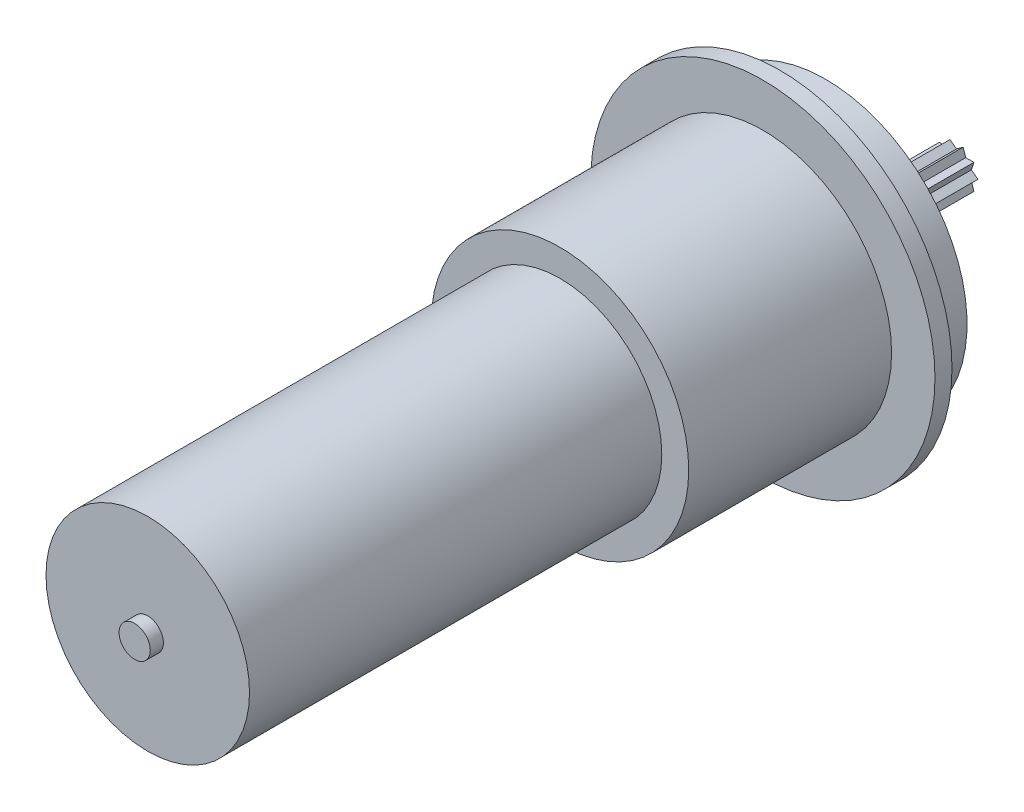
ISO-10303-21;
HEADER;
FILE_DESCRIPTION(('STEP AP214'),'2;1');
FILE_NAME('part.step','',(''),(''),'','','');
FILE_SCHEMA(('AUTOMOTIVE_DESIGN { 1 0 10303 214 1 1 1 1 }'));
ENDSEC;
DATA;
#1=APPLICATION_CONTEXT('core data for automotive mechanical design processes');
#2=APPLICATION_PROTOCOL_DEFINITION('international standard','automotive_design',2000,#1);
#3=PRODUCT_CONTEXT('',#1,'mechanical');
#4=PRODUCT('Part','Part','',(#3));
#5=PRODUCT_RELATED_PRODUCT_CATEGORY('part','',(#4));
#6=PRODUCT_DEFINITION_FORMATION('','',#4);
#7=PRODUCT_DEFINITION_CONTEXT('part definition',#1,'design');
#8=PRODUCT_DEFINITION('design','',#6,#7);
#9=PRODUCT_DEFINITION_SHAPE('','',#8);
#10=(LENGTH_UNIT() NAMED_UNIT(*) SI_UNIT(.MILLI.,.METRE.));
#11=(NAMED_UNIT(*) PLANE_ANGLE_UNIT() SI_UNIT($,.RADIAN.));
#12=(NAMED_UNIT(*) SI_UNIT($,.STERADIAN.) SOLID_ANGLE_UNIT());
#13=UNCERTAINTY_MEASURE_WITH_UNIT(LENGTH_MEASURE(1.E-05),#10,'distance_accuracy_value','');
#14=(GEOMETRIC_REPRESENTATION_CONTEXT(3) GLOBAL_UNCERTAINTY_ASSIGNED_CONTEXT((#13)) GLOBAL_UNIT_ASSIGNED_CONTEXT((#10,
#11,#12)) REPRESENTATION_CONTEXT('',''));
#15=CARTESIAN_POINT('',(0.,0.,0.));
#16=DIRECTION('',(0.,0.,1.));
#17=DIRECTION('',(1.,0.,0.));
#18=AXIS2_PLACEMENT_3D('',#15,#16,#17);
#19=CARTESIAN_POINT('',(0.,0.,78.74));
#20=DIRECTION('',(0.,0.,-1.));
#21=DIRECTION('',(-1.,0.,0.));
#22=AXIS2_PLACEMENT_3D('',#19,#20,#21);
#23=CYLINDRICAL_SURFACE('',#22,49.9618);
#24=CARTESIAN_POINT('',(0.,0.,78.74));
#25=DIRECTION('',(0.,0.,1.));
#26=DIRECTION('',(1.,0.,0.));
#27=AXIS2_PLACEMENT_3D('',#24,#25,#26);
#28=CIRCLE('',#27,49.9618);
#29=CARTESIAN_POINT('',(49.9618,0.,78.74));
#30=VERTEX_POINT('',#29);
#31=EDGE_CURVE('E212',#30,#30,#28,.T.);
#32=ORIENTED_EDGE('',*,*,#31,.F.);
#33=EDGE_LOOP('',(#32));
#34=FACE_BOUND('',#33,.T.);
#35=CARTESIAN_POINT('',(0.,0.,0.));
#36=DIRECTION('',(0.,0.,1.));
#37=DIRECTION('',(1.,0.,0.));
#38=AXIS2_PLACEMENT_3D('',#35,#36,#37);
#39=CIRCLE('',#38,49.9618);
#40=CARTESIAN_POINT('',(49.9618,0.,0.));
#41=VERTEX_POINT('',#40);
#42=EDGE_CURVE('E39',#41,#41,#39,.T.);
#43=ORIENTED_EDGE('',*,*,#42,.T.);
#44=EDGE_LOOP('',(#43));
#45=FACE_BOUND('',#44,.T.);
#46=ADVANCED_FACE('F36',(#34,#45),#23,.T.);
#47=CARTESIAN_POINT('',(0.,0.,78.74));
#48=DIRECTION('',(0.,0.,1.));
#49=DIRECTION('',(1.,0.,0.));
#50=AXIS2_PLACEMENT_3D('',#47,#48,#49);
#51=PLANE('',#50);
#52=CARTESIAN_POINT('',(0.,0.,78.74));
#53=DIRECTION('',(0.,0.,1.));
#54=DIRECTION('',(1.,0.,0.));
#55=AXIS2_PLACEMENT_3D('',#52,#53,#54);
#56=CIRCLE('',#55,39.4969999999999);
#57=CARTESIAN_POINT('',(39.4969999999999,0.,78.74));
#58=VERTEX_POINT('',#57);
#59=EDGE_CURVE('E44',#58,#58,#56,.T.);
#60=ORIENTED_EDGE('',*,*,#59,.F.);
#61=EDGE_LOOP('',(#60));
#62=FACE_BOUND('',#61,.T.);
#63=ORIENTED_EDGE('',*,*,#31,.T.);
#64=EDGE_LOOP('',(#63));
#65=FACE_BOUND('',#64,.T.);
#66=ADVANCED_FACE('F234',(#62,#65),#51,.T.);
#67=CARTESIAN_POINT('',(0.,0.,-6.604));
#68=DIRECTION('',(0.,0.,1.));
#69=DIRECTION('',(1.,0.,0.));
#70=AXIS2_PLACEMENT_3D('',#67,#68,#69);
#71=CYLINDRICAL_SURFACE('',#70,66.802);
#72=CARTESIAN_POINT('',(0.,0.,-6.604));
#73=DIRECTION('',(0.,0.,-1.));
#74=DIRECTION('',(-1.,0.,0.));
#75=AXIS2_PLACEMENT_3D('',#72,#73,#74);
#76=CIRCLE('',#75,66.802);
#77=CARTESIAN_POINT('',(66.802,0.,-6.604));
#78=VERTEX_POINT('',#77);
#79=EDGE_CURVE('E213',#78,#78,#76,.T.);
#80=CARTESIAN_POINT('',(0.,0.,0.));
#81=DIRECTION('',(0.,0.,-1.));
#82=DIRECTION('',(-1.,0.,0.));
#83=AXIS2_PLACEMENT_3D('',#80,#81,#82);
#84=CIRCLE('',#83,66.802);
#85=CARTESIAN_POINT('',(66.802,0.,0.));
#86=VERTEX_POINT('',#85);
#87=EDGE_CURVE('E209',#86,#86,#84,.T.);
#88=CARTESIAN_POINT('',(66.802,0.,-6.604));
#89=CARTESIAN_POINT('',(66.802,0.,-6.53520833333333));
#90=CARTESIAN_POINT('',(66.802,0.,-6.46641666666667));
#91=CARTESIAN_POINT('',(66.802,0.,-6.32883333333333));
#92=CARTESIAN_POINT('',(66.802,0.,-6.26004166666667));
#93=CARTESIAN_POINT('',(66.802,0.,-6.12245833333333));
#94=CARTESIAN_POINT('',(66.802,0.,-6.05366666666667));
#95=CARTESIAN_POINT('',(66.802,0.,-5.91608333333333));
#96=CARTESIAN_POINT('',(66.802,0.,-5.84729166666667));
#97=CARTESIAN_POINT('',(66.802,0.,-5.70970833333333));
#98=CARTESIAN_POINT('',(66.802,0.,-5.64091666666667));
#99=CARTESIAN_POINT('',(66.802,0.,-5.50333333333333));
#100=CARTESIAN_POINT('',(66.802,0.,-5.43454166666667));
#101=CARTESIAN_POINT('',(66.802,0.,-5.29695833333333));
#102=CARTESIAN_POINT('',(66.802,0.,-5.22816666666667));
#103=CARTESIAN_POINT('',(66.802,0.,-5.09058333333333));
#104=CARTESIAN_POINT('',(66.802,0.,-5.02179166666667));
#105=CARTESIAN_POINT('',(66.802,0.,-4.88420833333333));
#106=CARTESIAN_POINT('',(66.802,0.,-4.81541666666667));
#107=CARTESIAN_POINT('',(66.802,0.,-4.67783333333333));
#108=CARTESIAN_POINT('',(66.802,0.,-4.60904166666667));
#109=CARTESIAN_POINT('',(66.802,0.,-4.47145833333333));
#110=CARTESIAN_POINT('',(66.802,0.,-4.40266666666667));
#111=CARTESIAN_POINT('',(66.802,0.,-4.26508333333333));
#112=CARTESIAN_POINT('',(66.802,0.,-4.19629166666667));
#113=CARTESIAN_POINT('',(66.802,0.,-4.05870833333333));
#114=CARTESIAN_POINT('',(66.802,0.,-3.98991666666667));
#115=CARTESIAN_POINT('',(66.802,0.,-3.85233333333333));
#116=CARTESIAN_POINT('',(66.802,0.,-3.78354166666667));
#117=CARTESIAN_POINT('',(66.802,0.,-3.64595833333333));
#118=CARTESIAN_POINT('',(66.802,0.,-3.57716666666667));
#119=CARTESIAN_POINT('',(66.802,0.,-3.43958333333333));
#120=CARTESIAN_POINT('',(66.802,0.,-3.37079166666667));
#121=CARTESIAN_POINT('',(66.802,0.,-3.23320833333333));
#122=CARTESIAN_POINT('',(66.802,0.,-3.16441666666667));
#123=CARTESIAN_POINT('',(66.802,0.,-3.02683333333333));
#124=CARTESIAN_POINT('',(66.802,0.,-2.95804166666667));
#125=CARTESIAN_POINT('',(66.802,0.,-2.82045833333333));
#126=CARTESIAN_POINT('',(66.802,0.,-2.75166666666667));
#127=CARTESIAN_POINT('',(66.802,0.,-2.61408333333333));
#128=CARTESIAN_POINT('',(66.802,0.,-2.54529166666667));
#129=CARTESIAN_POINT('',(66.802,0.,-2.40770833333333));
#130=CARTESIAN_POINT('',(66.802,0.,-2.33891666666667));
#131=CARTESIAN_POINT('',(66.802,0.,-2.20133333333333));
#132=CARTESIAN_POINT('',(66.802,0.,-2.13254166666667));
#133=CARTESIAN_POINT('',(66.802,0.,-1.99495833333333));
#134=CARTESIAN_POINT('',(66.802,0.,-1.92616666666667));
#135=CARTESIAN_POINT('',(66.802,0.,-1.78858333333333));
#136=CARTESIAN_POINT('',(66.802,0.,-1.71979166666667));
#137=CARTESIAN_POINT('',(66.802,0.,-1.58220833333333));
#138=CARTESIAN_POINT('',(66.802,0.,-1.51341666666667));
#139=CARTESIAN_POINT('',(66.802,0.,-1.37583333333333));
#140=CARTESIAN_POINT('',(66.802,0.,-1.30704166666667));
#141=CARTESIAN_POINT('',(66.802,0.,-1.16945833333333));
#142=CARTESIAN_POINT('',(66.802,0.,-1.10066666666667));
#143=CARTESIAN_POINT('',(66.802,0.,-0.963083333333333));
#144=CARTESIAN_POINT('',(66.802,0.,-0.894291666666666));
#145=CARTESIAN_POINT('',(66.802,0.,-0.756708333333333));
#146=CARTESIAN_POINT('',(66.802,0.,-0.687916666666667));
#147=CARTESIAN_POINT('',(66.802,0.,-0.550333333333333));
#148=CARTESIAN_POINT('',(66.802,0.,-0.481541666666667));
#149=CARTESIAN_POINT('',(66.802,0.,-0.343958333333333));
#150=CARTESIAN_POINT('',(66.802,0.,-0.275166666666667));
#151=CARTESIAN_POINT('',(66.802,0.,-0.137583333333333));
#152=CARTESIAN_POINT('',(66.802,0.,-0.0687916666666666));
#153=CARTESIAN_POINT('',(66.802,0.,0.));
#154=B_SPLINE_CURVE_WITH_KNOTS('',3,(#88,#89,#90,#91,#92,#93,#94,#95,#96,#97,#98,#99,#100,#101,
#102,#103,#104,#105,#106,#107,#108,#109,#110,#111,#112,#113,#114,#115,#116,#117,#118,#119,#120,
#121,#122,#123,#124,#125,#126,#127,#128,#129,#130,#131,#132,#133,#134,#135,#136,#137,#138,#139,
#140,#141,#142,#143,#144,#145,#146,#147,#148,#149,#150,#151,#152,#153),.UNSPECIFIED.,.F.,.F.,(4,
2,2,2,2,2,2,2,2,2,2,2,2,2,2,2,2,2,2,2,2,2,2,2,2,2,2,2,2,2,2,2,4),(0.,0.206375,0.41275,0.619125,
0.8255,1.031875,1.23825,1.444625,1.651,1.857375,2.06375,2.270125,2.4765,2.682875,2.88925,
3.095625,3.302,3.508375,3.71475,3.921125,4.1275,4.333875,4.54025,4.746625,4.953,5.159375,
5.36575,5.572125,5.7785,5.984875,6.19125,6.397625,6.604),.UNSPECIFIED.);
#155=EDGE_CURVE('BSEAM232',#78,#86,#154,.T.);
#156=ORIENTED_EDGE('',*,*,#79,.F.);
#157=ORIENTED_EDGE('',*,*,#87,.T.);
#158=ORIENTED_EDGE('',*,*,#155,.T.);
#159=ORIENTED_EDGE('',*,*,#155,.F.);
#160=EDGE_LOOP('',(#156,#158,#157,#159));
#161=FACE_BOUND('',#160,.T.);
#162=ADVANCED_FACE('F232',(#161),#71,.T.);
#163=CARTESIAN_POINT('',(0.,0.,-6.604));
#164=DIRECTION('',(0.,0.,-1.));
#165=DIRECTION('',(-1.,0.,0.));
#166=AXIS2_PLACEMENT_3D('',#163,#164,#165);
#167=PLANE('',#166);
#168=CARTESIAN_POINT('',(0.,0.,-6.604));
#169=DIRECTION('',(0.,0.,-1.));
#170=DIRECTION('',(-1.,0.,0.));
#171=AXIS2_PLACEMENT_3D('',#168,#169,#170);
#172=CIRCLE('',#171,54.864);
#173=CARTESIAN_POINT('',(-54.864,0.,-6.604));
#174=VERTEX_POINT('',#173);
#175=EDGE_CURVE('E206',#174,#174,#172,.T.);
#176=ORIENTED_EDGE('',*,*,#175,.F.);
#177=EDGE_LOOP('',(#176));
#178=FACE_BOUND('',#177,.T.);
#179=ORIENTED_EDGE('',*,*,#79,.T.);
#180=EDGE_LOOP('',(#179));
#181=FACE_BOUND('',#180,.T.);
#182=ADVANCED_FACE('F228',(#178,#181),#167,.T.);
#183=CARTESIAN_POINT('',(0.,0.,0.));
#184=DIRECTION('',(0.,0.,-1.));
#185=DIRECTION('',(-1.,0.,0.));
#186=AXIS2_PLACEMENT_3D('',#183,#184,#185);
#187=PLANE('',#186);
#188=ORIENTED_EDGE('',*,*,#42,.F.);
#189=EDGE_LOOP('',(#188));
#190=FACE_BOUND('',#189,.T.);
#191=ORIENTED_EDGE('',*,*,#87,.F.);
#192=EDGE_LOOP('',(#191));
#193=FACE_BOUND('',#192,.T.);
#194=ADVANCED_FACE('F224',(#190,#193),#187,.F.);
#195=CARTESIAN_POINT('',(0.,0.,-24.384));
#196=DIRECTION('',(0.,0.,1.));
#197=DIRECTION('',(1.,0.,0.));
#198=AXIS2_PLACEMENT_3D('',#195,#196,#197);
#199=CYLINDRICAL_SURFACE('',#198,54.864);
#200=CARTESIAN_POINT('',(0.,0.,-24.384));
#201=DIRECTION('',(0.,0.,-1.));
#202=DIRECTION('',(-1.,0.,0.));
#203=AXIS2_PLACEMENT_3D('',#200,#201,#202);
#204=CIRCLE('',#203,54.864);
#205=CARTESIAN_POINT('',(-54.864,0.,-24.384));
#206=VERTEX_POINT('',#205);
#207=EDGE_CURVE('E197',#206,#206,#204,.T.);
#208=ORIENTED_EDGE('',*,*,#207,.F.);
#209=EDGE_LOOP('',(#208));
#210=FACE_BOUND('',#209,.T.);
#211=ORIENTED_EDGE('',*,*,#175,.T.);
#212=EDGE_LOOP('',(#211));
#213=FACE_BOUND('',#212,.T.);
#214=ADVANCED_FACE('F227',(#210,#213),#199,.T.);
#215=CARTESIAN_POINT('',(0.,0.,-24.384));
#216=DIRECTION('',(0.,0.,-1.));
#217=DIRECTION('',(-1.,0.,0.));
#218=AXIS2_PLACEMENT_3D('',#215,#216,#217);
#219=PLANE('',#218);
#220=CARTESIAN_POINT('',(0.,0.,-24.384));
#221=DIRECTION('',(0.,0.,-1.));
#222=DIRECTION('',(-1.,0.,0.));
#223=AXIS2_PLACEMENT_3D('',#220,#221,#222);
#224=CIRCLE('',#223,11.8780065255691);
#225=CARTESIAN_POINT('',(-11.8780065255691,0.,-24.384));
#226=VERTEX_POINT('',#225);
#227=EDGE_CURVE('E203',#226,#226,#224,.T.);
#228=ORIENTED_EDGE('',*,*,#227,.F.);
#229=EDGE_LOOP('',(#228));
#230=FACE_BOUND('',#229,.T.);
#231=ORIENTED_EDGE('',*,*,#207,.T.);
#232=EDGE_LOOP('',(#231));
#233=FACE_BOUND('',#232,.T.);
#234=ADVANCED_FACE('F278',(#230,#233),#219,.T.);
#235=CARTESIAN_POINT('',(0.,0.,-37.084));
#236=DIRECTION('',(0.,0.,1.));
#237=DIRECTION('',(1.,0.,0.));
#238=AXIS2_PLACEMENT_3D('',#235,#236,#237);
#239=CYLINDRICAL_SURFACE('',#238,11.8780065255691);
#240=CARTESIAN_POINT('',(0.,0.,-37.084));
#241=DIRECTION('',(0.,0.,-1.));
#242=DIRECTION('',(-1.,0.,0.));
#243=AXIS2_PLACEMENT_3D('',#240,#241,#242);
#244=CIRCLE('',#243,11.8780065255691);
#245=CARTESIAN_POINT('',(-11.8780065255691,0.,-37.084));
#246=VERTEX_POINT('',#245);
#247=EDGE_CURVE('E194',#246,#246,#244,.T.);
#248=ORIENTED_EDGE('',*,*,#247,.F.);
#249=EDGE_LOOP('',(#248));
#250=FACE_BOUND('',#249,.T.);
#251=ORIENTED_EDGE('',*,*,#227,.T.);
#252=EDGE_LOOP('',(#251));
#253=FACE_BOUND('',#252,.T.);
#254=ADVANCED_FACE('F283',(#250,#253),#239,.T.);
#255=CARTESIAN_POINT('',(0.,0.,-37.084));
#256=DIRECTION('',(0.,0.,-1.));
#257=DIRECTION('',(-1.,0.,0.));
#258=AXIS2_PLACEMENT_3D('',#255,#256,#257);
#259=PLANE('',#258);
#260=DIRECTION('',(-0.809016994374932,0.587785252292494,0.));
#261=VECTOR('',#260,1.);
#262=CARTESIAN_POINT('',(-5.74575498030823,-1.86690896283038,-37.084));
#263=LINE('',#262,#261);
#264=CARTESIAN_POINT('',(-5.74575498030823,-1.86690896283038,-37.084));
#265=VERTEX_POINT('',#264);
#266=CARTESIAN_POINT('',(-8.3153347239136,1.29533520327135E-13,-37.084));
#267=VERTEX_POINT('',#266);
#268=EDGE_CURVE('E52',#265,#267,#263,.T.);
#269=ORIENTED_EDGE('',*,*,#268,.F.);
#270=DIRECTION('',(0.309016994375006,0.951056516295135,0.));
#271=VECTOR('',#270,1.);
#272=CARTESIAN_POINT('',(-6.72724710556244,-4.88763111859181,-37.084));
#273=LINE('',#272,#271);
#274=CARTESIAN_POINT('',(-6.72724710556244,-4.88763111859181,-37.084));
#275=VERTEX_POINT('',#274);
#276=EDGE_CURVE('E56',#275,#265,#273,.T.);
#277=ORIENTED_EDGE('',*,*,#276,.F.);
#278=DIRECTION('',(-1.,0.,0.));
#279=VECTOR('',#278,1.);
#280=CARTESIAN_POINT('',(-3.55107186885967,-4.88763111859189,-37.084));
#281=LINE('',#280,#279);
#282=CARTESIAN_POINT('',(-3.55107186885967,-4.88763111859189,-37.084));
#283=VERTEX_POINT('',#282);
#284=EDGE_CURVE('E642',#283,#275,#281,.T.);
#285=ORIENTED_EDGE('',*,*,#284,.F.);
#286=DIRECTION('',(-0.309016994374889,0.951056516295173,0.));
#287=VECTOR('',#286,1.);
#288=CARTESIAN_POINT('',(-2.56957974360582,-7.90835327435344,-37.084));
#289=LINE('',#288,#287);
#290=CARTESIAN_POINT('',(-2.56957974360582,-7.90835327435344,-37.084));
#291=VERTEX_POINT('',#290);
#292=EDGE_CURVE('E644',#291,#283,#289,.T.);
#293=ORIENTED_EDGE('',*,*,#292,.F.);
#294=DIRECTION('',(-0.809016994374963,-0.587785252292452,0.));
#295=VECTOR('',#294,1.);
#296=CARTESIAN_POINT('',(-3.5576250067201E-13,-6.04144431152306,-37.084));
#297=LINE('',#296,#295);
#298=CARTESIAN_POINT('',(-3.5576250067201E-13,-6.04144431152306,-37.084));
#299=VERTEX_POINT('',#298);
#300=EDGE_CURVE('E647',#299,#291,#297,.T.);
#301=ORIENTED_EDGE('',*,*,#300,.F.);
#302=DIRECTION('',(-0.809016994374911,0.587785252292523,0.));
#303=VECTOR('',#302,1.);
#304=CARTESIAN_POINT('',(2.56957974360496,-7.90835327435367,-37.084));
#305=LINE('',#304,#303);
#306=CARTESIAN_POINT('',(2.56957974360496,-7.90835327435367,-37.084));
#307=VERTEX_POINT('',#306);
#308=EDGE_CURVE('E650',#307,#299,#305,.T.);
#309=ORIENTED_EDGE('',*,*,#308,.F.);
#310=DIRECTION('',(-0.309016994374972,-0.951056516295145,0.));
#311=VECTOR('',#310,1.);
#312=CARTESIAN_POINT('',(3.55107186885906,-4.88763111859222,-37.084));
#313=LINE('',#312,#311);
#314=CARTESIAN_POINT('',(3.55107186885906,-4.88763111859222,-37.084));
#315=VERTEX_POINT('',#314);
#316=EDGE_CURVE('E653',#315,#307,#313,.T.);
#317=ORIENTED_EDGE('',*,*,#316,.F.);
#318=DIRECTION('',(-1.,0.,0.));
#319=VECTOR('',#318,1.);
#320=CARTESIAN_POINT('',(6.72724710556185,-4.88763111859242,-37.084));
#321=LINE('',#320,#319);
#322=CARTESIAN_POINT('',(6.72724710556185,-4.88763111859242,-37.084));
#323=VERTEX_POINT('',#322);
#324=EDGE_CURVE('E656',#323,#315,#321,.T.);
#325=ORIENTED_EDGE('',*,*,#324,.F.);
#326=DIRECTION('',(0.309016994374923,-0.951056516295162,0.));
#327=VECTOR('',#326,1.);
#328=CARTESIAN_POINT('',(5.7457549803079,-1.86690896283091,-37.084));
#329=LINE('',#328,#327);
#330=CARTESIAN_POINT('',(5.7457549803079,-1.86690896283091,-37.084));
#331=VERTEX_POINT('',#330);
#332=EDGE_CURVE('E659',#331,#323,#329,.T.);
#333=ORIENTED_EDGE('',*,*,#332,.F.);
#334=DIRECTION('',(-0.809016994374984,-0.587785252292423,0.));
#335=VECTOR('',#334,1.);
#336=CARTESIAN_POINT('',(8.31533472391344,-6.15728958066373E-13,-37.084));
#337=LINE('',#336,#335);
#338=CARTESIAN_POINT('',(8.31533472391344,-6.15728958066373E-13,-37.084));
#339=VERTEX_POINT('',#338);
#340=EDGE_CURVE('E662',#339,#331,#337,.T.);
#341=ORIENTED_EDGE('',*,*,#340,.F.);
#342=DIRECTION('',(0.809016994374932,-0.587785252292494,0.));
#343=VECTOR('',#342,1.);
#344=CARTESIAN_POINT('',(5.74575498030807,1.8669089628299,-37.084));
#345=LINE('',#344,#343);
#346=CARTESIAN_POINT('',(5.74575498030807,1.8669089628299,-37.084));
#347=VERTEX_POINT('',#346);
#348=EDGE_CURVE('E665',#347,#339,#345,.T.);
#349=ORIENTED_EDGE('',*,*,#348,.F.);
#350=DIRECTION('',(-0.309016994375006,-0.951056516295135,0.));
#351=VECTOR('',#350,1.);
#352=CARTESIAN_POINT('',(6.72724710556229,4.88763111859133,-37.084));
#353=LINE('',#352,#351);
#354=CARTESIAN_POINT('',(6.72724710556229,4.88763111859133,-37.084));
#355=VERTEX_POINT('',#354);
#356=EDGE_CURVE('E668',#355,#347,#353,.T.);
#357=ORIENTED_EDGE('',*,*,#356,.F.);
#358=DIRECTION('',(1.,0.,0.));
#359=VECTOR('',#358,1.);
#360=CARTESIAN_POINT('',(3.55107186885951,4.88763111859141,-37.084));
#361=LINE('',#360,#359);
#362=CARTESIAN_POINT('',(3.55107186885951,4.88763111859141,-37.084));
#363=VERTEX_POINT('',#362);
#364=EDGE_CURVE('E671',#363,#355,#361,.T.);
#365=ORIENTED_EDGE('',*,*,#364,.F.);
#366=DIRECTION('',(0.30901699437489,-0.951056516295172,0.));
#367=VECTOR('',#366,1.);
#368=CARTESIAN_POINT('',(2.56957974360566,7.90835327435296,-37.084));
#369=LINE('',#368,#367);
#370=CARTESIAN_POINT('',(2.56957974360566,7.90835327435296,-37.084));
#371=VERTEX_POINT('',#370);
#372=EDGE_CURVE('E674',#371,#363,#369,.T.);
#373=ORIENTED_EDGE('',*,*,#372,.F.);
#374=DIRECTION('',(0.809016994374962,0.587785252292453,0.));
#375=VECTOR('',#374,1.);
#376=CARTESIAN_POINT('',(2.00287909137588E-13,6.04144431152258,-37.084));
#377=LINE('',#376,#375);
#378=CARTESIAN_POINT('',(2.00287909137588E-13,6.04144431152258,-37.084));
#379=VERTEX_POINT('',#378);
#380=EDGE_CURVE('E677',#379,#371,#377,.T.);
#381=ORIENTED_EDGE('',*,*,#380,.F.);
#382=DIRECTION('',(0.809016994374911,-0.587785252292523,0.));
#383=VECTOR('',#382,1.);
#384=CARTESIAN_POINT('',(-2.56957974360511,7.90835327435319,-37.084));
#385=LINE('',#384,#383);
#386=CARTESIAN_POINT('',(-2.56957974360511,7.90835327435319,-37.084));
#387=VERTEX_POINT('',#386);
#388=EDGE_CURVE('E680',#387,#379,#385,.T.);
#389=ORIENTED_EDGE('',*,*,#388,.F.);
#390=DIRECTION('',(0.309016994374972,0.951056516295146,0.));
#391=VECTOR('',#390,1.);
#392=CARTESIAN_POINT('',(-3.55107186885922,4.88763111859173,-37.084));
#393=LINE('',#392,#391);
#394=CARTESIAN_POINT('',(-3.55107186885922,4.88763111859173,-37.084));
#395=VERTEX_POINT('',#394);
#396=EDGE_CURVE('E683',#395,#387,#393,.T.);
#397=ORIENTED_EDGE('',*,*,#396,.F.);
#398=DIRECTION('',(1.,0.,0.));
#399=VECTOR('',#398,1.);
#400=CARTESIAN_POINT('',(-6.72724710556201,4.88763111859193,-37.084));
#401=LINE('',#400,#399);
#402=CARTESIAN_POINT('',(-6.72724710556201,4.88763111859193,-37.084));
#403=VERTEX_POINT('',#402);
#404=EDGE_CURVE('E584',#403,#395,#401,.T.);
#405=ORIENTED_EDGE('',*,*,#404,.F.);
#406=DIRECTION('',(-0.309016994374923,0.951056516295162,0.));
#407=VECTOR('',#406,1.);
#408=CARTESIAN_POINT('',(-5.74575498030806,1.86690896283043,-37.084));
#409=LINE('',#408,#407);
#410=CARTESIAN_POINT('',(-5.74575498030806,1.86690896283043,-37.084));
#411=VERTEX_POINT('',#410);
#412=EDGE_CURVE('E581',#411,#403,#409,.T.);
#413=ORIENTED_EDGE('',*,*,#412,.F.);
#414=DIRECTION('',(0.809016994374984,0.587785252292424,0.));
#415=VECTOR('',#414,1.);
#416=CARTESIAN_POINT('',(-8.3153347239136,1.29533520327135E-13,-37.084));
#417=LINE('',#416,#415);
#418=EDGE_CURVE('E585',#267,#411,#417,.T.);
#419=ORIENTED_EDGE('',*,*,#418,.F.);
#420=EDGE_LOOP('',(#269,#277,#285,#293,#301,#309,#317,#325,#333,#341,#349,#357,#365,#373,#381,
#389,#397,#405,#413,#419));
#421=FACE_BOUND('',#420,.T.);
#422=ORIENTED_EDGE('',*,*,#247,.T.);
#423=EDGE_LOOP('',(#422));
#424=FACE_BOUND('',#423,.T.);
#425=ADVANCED_FACE('F303',(#421,#424),#259,.T.);
#426=CARTESIAN_POINT('',(-5.74575498030823,-1.86690896283038,-75.184));
#427=DIRECTION('',(0.587785252292494,0.809016994374932,0.));
#428=DIRECTION('',(-0.809016994374932,0.587785252292494,0.));
#429=AXIS2_PLACEMENT_3D('',#426,#427,#428);
#430=PLANE('',#429);
#431=ORIENTED_EDGE('',*,*,#268,.T.);
#432=DIRECTION('',(0.,0.,1.));
#433=VECTOR('',#432,1.);
#434=CARTESIAN_POINT('',(-8.3153347239136,1.29533520327135E-13,-75.184));
#435=LINE('',#434,#433);
#436=CARTESIAN_POINT('',(-8.3153347239136,1.29533520327135E-13,-75.184));
#437=VERTEX_POINT('',#436);
#438=EDGE_CURVE('E177',#437,#267,#435,.T.);
#439=ORIENTED_EDGE('',*,*,#438,.F.);
#440=DIRECTION('',(-0.809016994374932,0.587785252292494,0.));
#441=VECTOR('',#440,1.);
#442=CARTESIAN_POINT('',(-5.74575498030823,-1.86690896283038,-75.184));
#443=LINE('',#442,#441);
#444=CARTESIAN_POINT('',(-5.74575498030823,-1.86690896283038,-75.184));
#445=VERTEX_POINT('',#444);
#446=EDGE_CURVE('E183',#445,#437,#443,.T.);
#447=ORIENTED_EDGE('',*,*,#446,.F.);
#448=DIRECTION('',(0.,0.,1.));
#449=VECTOR('',#448,1.);
#450=CARTESIAN_POINT('',(-5.74575498030823,-1.86690896283038,-75.184));
#451=LINE('',#450,#449);
#452=EDGE_CURVE('E639',#445,#265,#451,.T.);
#453=ORIENTED_EDGE('',*,*,#452,.T.);
#454=EDGE_LOOP('',(#431,#439,#447,#453));
#455=FACE_BOUND('',#454,.T.);
#456=ADVANCED_FACE('F193',(#455),#430,.F.);
#457=CARTESIAN_POINT('',(-8.3153347239136,1.29533520327135E-13,-75.184));
#458=DIRECTION('',(0.587785252292423,-0.809016994374984,0.));
#459=DIRECTION('',(0.809016994374984,0.587785252292423,0.));
#460=AXIS2_PLACEMENT_3D('',#457,#458,#459);
#461=PLANE('',#460);
#462=ORIENTED_EDGE('',*,*,#418,.T.);
#463=DIRECTION('',(0.,0.,1.));
#464=VECTOR('',#463,1.);
#465=CARTESIAN_POINT('',(-5.74575498030806,1.86690896283043,-75.184));
#466=LINE('',#465,#464);
#467=CARTESIAN_POINT('',(-5.74575498030806,1.86690896283043,-75.184));
#468=VERTEX_POINT('',#467);
#469=EDGE_CURVE('E179',#468,#411,#466,.T.);
#470=ORIENTED_EDGE('',*,*,#469,.F.);
#471=DIRECTION('',(0.809016994374984,0.587785252292424,0.));
#472=VECTOR('',#471,1.);
#473=CARTESIAN_POINT('',(-8.3153347239136,1.29533520327135E-13,-75.184));
#474=LINE('',#473,#472);
#475=EDGE_CURVE('E172',#437,#468,#474,.T.);
#476=ORIENTED_EDGE('',*,*,#475,.F.);
#477=ORIENTED_EDGE('',*,*,#438,.T.);
#478=EDGE_LOOP('',(#462,#470,#476,#477));
#479=FACE_BOUND('',#478,.T.);
#480=ADVANCED_FACE('F175',(#479),#461,.F.);
#481=CARTESIAN_POINT('',(-5.74575498030806,1.86690896283043,-75.184));
#482=DIRECTION('',(0.951056516295161,0.309016994374923,0.));
#483=DIRECTION('',(-0.309016994374923,0.951056516295162,0.));
#484=AXIS2_PLACEMENT_3D('',#481,#482,#483);
#485=PLANE('',#484);
#486=ORIENTED_EDGE('',*,*,#412,.T.);
#487=DIRECTION('',(0.,0.,1.));
#488=VECTOR('',#487,1.);
#489=CARTESIAN_POINT('',(-6.72724710556201,4.88763111859193,-75.184));
#490=LINE('',#489,#488);
#491=CARTESIAN_POINT('',(-6.72724710556201,4.88763111859193,-75.184));
#492=VERTEX_POINT('',#491);
#493=EDGE_CURVE('E199',#492,#403,#490,.T.);
#494=ORIENTED_EDGE('',*,*,#493,.F.);
#495=DIRECTION('',(-0.309016994374923,0.951056516295162,0.));
#496=VECTOR('',#495,1.);
#497=CARTESIAN_POINT('',(-5.74575498030806,1.86690896283043,-75.184));
#498=LINE('',#497,#496);
#499=EDGE_CURVE('E182',#468,#492,#498,.T.);
#500=ORIENTED_EDGE('',*,*,#499,.F.);
#501=ORIENTED_EDGE('',*,*,#469,.T.);
#502=EDGE_LOOP('',(#486,#494,#500,#501));
#503=FACE_BOUND('',#502,.T.);
#504=ADVANCED_FACE('F515',(#503),#485,.F.);
#505=CARTESIAN_POINT('',(-6.72724710556201,4.88763111859193,-75.184));
#506=DIRECTION('',(0.,-1.,0.));
#507=DIRECTION('',(1.,0.,0.));
#508=AXIS2_PLACEMENT_3D('',#505,#506,#507);
#509=PLANE('',#508);
#510=ORIENTED_EDGE('',*,*,#404,.T.);
#511=DIRECTION('',(0.,0.,1.));
#512=VECTOR('',#511,1.);
#513=CARTESIAN_POINT('',(-3.55107186885922,4.88763111859173,-75.184));
#514=LINE('',#513,#512);
#515=CARTESIAN_POINT('',(-3.55107186885922,4.88763111859173,-75.184));
#516=VERTEX_POINT('',#515);
#517=EDGE_CURVE('E591',#516,#395,#514,.T.);
#518=ORIENTED_EDGE('',*,*,#517,.F.);
#519=DIRECTION('',(1.,0.,0.));
#520=VECTOR('',#519,1.);
#521=CARTESIAN_POINT('',(-6.72724710556201,4.88763111859193,-75.184));
#522=LINE('',#521,#520);
#523=EDGE_CURVE('E590',#492,#516,#522,.T.);
#524=ORIENTED_EDGE('',*,*,#523,.F.);
#525=ORIENTED_EDGE('',*,*,#493,.T.);
#526=EDGE_LOOP('',(#510,#518,#524,#525));
#527=FACE_BOUND('',#526,.T.);
#528=ADVANCED_FACE('F506',(#527),#509,.F.);
#529=CARTESIAN_POINT('',(-3.55107186885922,4.88763111859173,-75.184));
#530=DIRECTION('',(0.951056516295146,-0.309016994374972,0.));
#531=DIRECTION('',(0.309016994374972,0.951056516295146,0.));
#532=AXIS2_PLACEMENT_3D('',#529,#530,#531);
#533=PLANE('',#532);
#534=ORIENTED_EDGE('',*,*,#396,.T.);
#535=DIRECTION('',(0.,0.,1.));
#536=VECTOR('',#535,1.);
#537=CARTESIAN_POINT('',(-2.56957974360511,7.90835327435319,-75.184));
#538=LINE('',#537,#536);
#539=CARTESIAN_POINT('',(-2.56957974360511,7.90835327435319,-75.184));
#540=VERTEX_POINT('',#539);
#541=EDGE_CURVE('E592',#540,#387,#538,.T.);
#542=ORIENTED_EDGE('',*,*,#541,.F.);
#543=DIRECTION('',(0.309016994374972,0.951056516295146,0.));
#544=VECTOR('',#543,1.);
#545=CARTESIAN_POINT('',(-3.55107186885922,4.88763111859173,-75.184));
#546=LINE('',#545,#544);
#547=EDGE_CURVE('E719',#516,#540,#546,.T.);
#548=ORIENTED_EDGE('',*,*,#547,.F.);
#549=ORIENTED_EDGE('',*,*,#517,.T.);
#550=EDGE_LOOP('',(#534,#542,#548,#549));
#551=FACE_BOUND('',#550,.T.);
#552=ADVANCED_FACE('F497',(#551),#533,.F.);
#553=CARTESIAN_POINT('',(-2.56957974360511,7.90835327435319,-75.184));
#554=DIRECTION('',(-0.587785252292523,-0.809016994374911,0.));
#555=DIRECTION('',(0.809016994374911,-0.587785252292523,0.));
#556=AXIS2_PLACEMENT_3D('',#553,#554,#555);
#557=PLANE('',#556);
#558=ORIENTED_EDGE('',*,*,#388,.T.);
#559=DIRECTION('',(0.,0.,1.));
#560=VECTOR('',#559,1.);
#561=CARTESIAN_POINT('',(2.00287909137588E-13,6.04144431152258,-75.184));
#562=LINE('',#561,#560);
#563=CARTESIAN_POINT('',(2.00287909137588E-13,6.04144431152258,-75.184));
#564=VERTEX_POINT('',#563);
#565=EDGE_CURVE('E597',#564,#379,#562,.T.);
#566=ORIENTED_EDGE('',*,*,#565,.F.);
#567=DIRECTION('',(0.809016994374911,-0.587785252292523,0.));
#568=VECTOR('',#567,1.);
#569=CARTESIAN_POINT('',(-2.56957974360511,7.90835327435319,-75.184));
#570=LINE('',#569,#568);
#571=EDGE_CURVE('E717',#540,#564,#570,.T.);
#572=ORIENTED_EDGE('',*,*,#571,.F.);
#573=ORIENTED_EDGE('',*,*,#541,.T.);
#574=EDGE_LOOP('',(#558,#566,#572,#573));
#575=FACE_BOUND('',#574,.T.);
#576=ADVANCED_FACE('F488',(#575),#557,.F.);
#577=CARTESIAN_POINT('',(2.00287909137588E-13,6.04144431152258,-75.184));
#578=DIRECTION('',(0.587785252292453,-0.809016994374962,0.));
#579=DIRECTION('',(0.809016994374962,0.587785252292453,0.));
#580=AXIS2_PLACEMENT_3D('',#577,#578,#579);
#581=PLANE('',#580);
#582=ORIENTED_EDGE('',*,*,#380,.T.);
#583=DIRECTION('',(0.,0.,1.));
#584=VECTOR('',#583,1.);
#585=CARTESIAN_POINT('',(2.56957974360566,7.90835327435296,-75.184));
#586=LINE('',#585,#584);
#587=CARTESIAN_POINT('',(2.56957974360566,7.90835327435296,-75.184));
#588=VERTEX_POINT('',#587);
#589=EDGE_CURVE('E600',#588,#371,#586,.T.);
#590=ORIENTED_EDGE('',*,*,#589,.F.);
#591=DIRECTION('',(0.809016994374962,0.587785252292453,0.));
#592=VECTOR('',#591,1.);
#593=CARTESIAN_POINT('',(2.00287909137588E-13,6.04144431152258,-75.184));
#594=LINE('',#593,#592);
#595=EDGE_CURVE('E715',#564,#588,#594,.T.);
#596=ORIENTED_EDGE('',*,*,#595,.F.);
#597=ORIENTED_EDGE('',*,*,#565,.T.);
#598=EDGE_LOOP('',(#582,#590,#596,#597));
#599=FACE_BOUND('',#598,.T.);
#600=ADVANCED_FACE('F479',(#599),#581,.F.);
#601=CARTESIAN_POINT('',(2.56957974360566,7.90835327435296,-75.184));
#602=DIRECTION('',(-0.951056516295172,-0.30901699437489,0.));
#603=DIRECTION('',(0.30901699437489,-0.951056516295173,0.));
#604=AXIS2_PLACEMENT_3D('',#601,#602,#603);
#605=PLANE('',#604);
#606=ORIENTED_EDGE('',*,*,#372,.T.);
#607=DIRECTION('',(0.,0.,1.));
#608=VECTOR('',#607,1.);
#609=CARTESIAN_POINT('',(3.55107186885951,4.88763111859141,-75.184));
#610=LINE('',#609,#608);
#611=CARTESIAN_POINT('',(3.55107186885951,4.88763111859141,-75.184));
#612=VERTEX_POINT('',#611);
#613=EDGE_CURVE('E603',#612,#363,#610,.T.);
#614=ORIENTED_EDGE('',*,*,#613,.F.);
#615=DIRECTION('',(0.30901699437489,-0.951056516295172,0.));
#616=VECTOR('',#615,1.);
#617=CARTESIAN_POINT('',(2.56957974360566,7.90835327435296,-75.184));
#618=LINE('',#617,#616);
#619=EDGE_CURVE('E713',#588,#612,#618,.T.);
#620=ORIENTED_EDGE('',*,*,#619,.F.);
#621=ORIENTED_EDGE('',*,*,#589,.T.);
#622=EDGE_LOOP('',(#606,#614,#620,#621));
#623=FACE_BOUND('',#622,.T.);
#624=ADVANCED_FACE('F470',(#623),#605,.F.);
#625=CARTESIAN_POINT('',(3.55107186885951,4.88763111859141,-75.184));
#626=DIRECTION('',(0.,-1.,0.));
#627=DIRECTION('',(1.,0.,0.));
#628=AXIS2_PLACEMENT_3D('',#625,#626,#627);
#629=PLANE('',#628);
#630=ORIENTED_EDGE('',*,*,#364,.T.);
#631=DIRECTION('',(0.,0.,1.));
#632=VECTOR('',#631,1.);
#633=CARTESIAN_POINT('',(6.72724710556229,4.88763111859133,-75.184));
#634=LINE('',#633,#632);
#635=CARTESIAN_POINT('',(6.72724710556229,4.88763111859133,-75.184));
#636=VERTEX_POINT('',#635);
#637=EDGE_CURVE('E606',#636,#355,#634,.T.);
#638=ORIENTED_EDGE('',*,*,#637,.F.);
#639=DIRECTION('',(1.,0.,0.));
#640=VECTOR('',#639,1.);
#641=CARTESIAN_POINT('',(3.55107186885951,4.88763111859141,-75.184));
#642=LINE('',#641,#640);
#643=EDGE_CURVE('E711',#612,#636,#642,.T.);
#644=ORIENTED_EDGE('',*,*,#643,.F.);
#645=ORIENTED_EDGE('',*,*,#613,.T.);
#646=EDGE_LOOP('',(#630,#638,#644,#645));
#647=FACE_BOUND('',#646,.T.);
#648=ADVANCED_FACE('F461',(#647),#629,.F.);
#649=CARTESIAN_POINT('',(6.72724710556229,4.88763111859133,-75.184));
#650=DIRECTION('',(-0.951056516295135,0.309016994375006,0.));
#651=DIRECTION('',(-0.309016994375006,-0.951056516295135,0.));
#652=AXIS2_PLACEMENT_3D('',#649,#650,#651);
#653=PLANE('',#652);
#654=ORIENTED_EDGE('',*,*,#356,.T.);
#655=DIRECTION('',(0.,0.,1.));
#656=VECTOR('',#655,1.);
#657=CARTESIAN_POINT('',(5.74575498030807,1.8669089628299,-75.184));
#658=LINE('',#657,#656);
#659=CARTESIAN_POINT('',(5.74575498030807,1.8669089628299,-75.184));
#660=VERTEX_POINT('',#659);
#661=EDGE_CURVE('E609',#660,#347,#658,.T.);
#662=ORIENTED_EDGE('',*,*,#661,.F.);
#663=DIRECTION('',(-0.309016994375006,-0.951056516295135,0.));
#664=VECTOR('',#663,1.);
#665=CARTESIAN_POINT('',(6.72724710556229,4.88763111859133,-75.184));
#666=LINE('',#665,#664);
#667=EDGE_CURVE('E709',#636,#660,#666,.T.);
#668=ORIENTED_EDGE('',*,*,#667,.F.);
#669=ORIENTED_EDGE('',*,*,#637,.T.);
#670=EDGE_LOOP('',(#654,#662,#668,#669));
#671=FACE_BOUND('',#670,.T.);
#672=ADVANCED_FACE('F452',(#671),#653,.F.);
#673=CARTESIAN_POINT('',(5.74575498030807,1.8669089628299,-75.184));
#674=DIRECTION('',(-0.587785252292494,-0.809016994374932,0.));
#675=DIRECTION('',(0.809016994374932,-0.587785252292494,0.));
#676=AXIS2_PLACEMENT_3D('',#673,#674,#675);
#677=PLANE('',#676);
#678=ORIENTED_EDGE('',*,*,#348,.T.);
#679=DIRECTION('',(0.,0.,1.));
#680=VECTOR('',#679,1.);
#681=CARTESIAN_POINT('',(8.31533472391344,-6.15728958066373E-13,-75.184));
#682=LINE('',#681,#680);
#683=CARTESIAN_POINT('',(8.31533472391344,-6.15728958066373E-13,-75.184));
#684=VERTEX_POINT('',#683);
#685=EDGE_CURVE('E612',#684,#339,#682,.T.);
#686=ORIENTED_EDGE('',*,*,#685,.F.);
#687=DIRECTION('',(0.809016994374932,-0.587785252292494,0.));
#688=VECTOR('',#687,1.);
#689=CARTESIAN_POINT('',(5.74575498030807,1.8669089628299,-75.184));
#690=LINE('',#689,#688);
#691=EDGE_CURVE('E707',#660,#684,#690,.T.);
#692=ORIENTED_EDGE('',*,*,#691,.F.);
#693=ORIENTED_EDGE('',*,*,#661,.T.);
#694=EDGE_LOOP('',(#678,#686,#692,#693));
#695=FACE_BOUND('',#694,.T.);
#696=ADVANCED_FACE('F443',(#695),#677,.F.);
#697=CARTESIAN_POINT('',(8.31533472391344,-6.15728958066373E-13,-75.184));
#698=DIRECTION('',(-0.587785252292423,0.809016994374984,0.));
#699=DIRECTION('',(-0.809016994374984,-0.587785252292423,0.));
#700=AXIS2_PLACEMENT_3D('',#697,#698,#699);
#701=PLANE('',#700);
#702=ORIENTED_EDGE('',*,*,#340,.T.);
#703=DIRECTION('',(0.,0.,1.));
#704=VECTOR('',#703,1.);
#705=CARTESIAN_POINT('',(5.7457549803079,-1.86690896283091,-75.184));
#706=LINE('',#705,#704);
#707=CARTESIAN_POINT('',(5.7457549803079,-1.86690896283091,-75.184));
#708=VERTEX_POINT('',#707);
#709=EDGE_CURVE('E615',#708,#331,#706,.T.);
#710=ORIENTED_EDGE('',*,*,#709,.F.);
#711=DIRECTION('',(-0.809016994374984,-0.587785252292423,0.));
#712=VECTOR('',#711,1.);
#713=CARTESIAN_POINT('',(8.31533472391344,-6.15728958066373E-13,-75.184));
#714=LINE('',#713,#712);
#715=EDGE_CURVE('E705',#684,#708,#714,.T.);
#716=ORIENTED_EDGE('',*,*,#715,.F.);
#717=ORIENTED_EDGE('',*,*,#685,.T.);
#718=EDGE_LOOP('',(#702,#710,#716,#717));
#719=FACE_BOUND('',#718,.T.);
#720=ADVANCED_FACE('F434',(#719),#701,.F.);
#721=CARTESIAN_POINT('',(5.7457549803079,-1.86690896283091,-75.184));
#722=DIRECTION('',(-0.951056516295162,-0.309016994374923,0.));
#723=DIRECTION('',(0.309016994374923,-0.951056516295162,0.));
#724=AXIS2_PLACEMENT_3D('',#721,#722,#723);
#725=PLANE('',#724);
#726=ORIENTED_EDGE('',*,*,#332,.T.);
#727=DIRECTION('',(0.,0.,1.));
#728=VECTOR('',#727,1.);
#729=CARTESIAN_POINT('',(6.72724710556185,-4.88763111859242,-75.184));
#730=LINE('',#729,#728);
#731=CARTESIAN_POINT('',(6.72724710556185,-4.88763111859242,-75.184));
#732=VERTEX_POINT('',#731);
#733=EDGE_CURVE('E618',#732,#323,#730,.T.);
#734=ORIENTED_EDGE('',*,*,#733,.F.);
#735=DIRECTION('',(0.309016994374923,-0.951056516295162,0.));
#736=VECTOR('',#735,1.);
#737=CARTESIAN_POINT('',(5.7457549803079,-1.86690896283091,-75.184));
#738=LINE('',#737,#736);
#739=EDGE_CURVE('E703',#708,#732,#738,.T.);
#740=ORIENTED_EDGE('',*,*,#739,.F.);
#741=ORIENTED_EDGE('',*,*,#709,.T.);
#742=EDGE_LOOP('',(#726,#734,#740,#741));
#743=FACE_BOUND('',#742,.T.);
#744=ADVANCED_FACE('F425',(#743),#725,.F.);
#745=CARTESIAN_POINT('',(6.72724710556185,-4.88763111859242,-75.184));
#746=DIRECTION('',(0.,1.,0.));
#747=DIRECTION('',(-1.,0.,0.));
#748=AXIS2_PLACEMENT_3D('',#745,#746,#747);
#749=PLANE('',#748);
#750=ORIENTED_EDGE('',*,*,#324,.T.);
#751=DIRECTION('',(0.,0.,1.));
#752=VECTOR('',#751,1.);
#753=CARTESIAN_POINT('',(3.55107186885906,-4.88763111859222,-75.184));
#754=LINE('',#753,#752);
#755=CARTESIAN_POINT('',(3.55107186885906,-4.88763111859222,-75.184));
#756=VERTEX_POINT('',#755);
#757=EDGE_CURVE('E621',#756,#315,#754,.T.);
#758=ORIENTED_EDGE('',*,*,#757,.F.);
#759=DIRECTION('',(-1.,0.,0.));
#760=VECTOR('',#759,1.);
#761=CARTESIAN_POINT('',(6.72724710556185,-4.88763111859242,-75.184));
#762=LINE('',#761,#760);
#763=EDGE_CURVE('E701',#732,#756,#762,.T.);
#764=ORIENTED_EDGE('',*,*,#763,.F.);
#765=ORIENTED_EDGE('',*,*,#733,.T.);
#766=EDGE_LOOP('',(#750,#758,#764,#765));
#767=FACE_BOUND('',#766,.T.);
#768=ADVANCED_FACE('F416',(#767),#749,.F.);
#769=CARTESIAN_POINT('',(3.55107186885906,-4.88763111859222,-75.184));
#770=DIRECTION('',(-0.951056516295145,0.309016994374972,0.));
#771=DIRECTION('',(-0.309016994374972,-0.951056516295146,0.));
#772=AXIS2_PLACEMENT_3D('',#769,#770,#771);
#773=PLANE('',#772);
#774=ORIENTED_EDGE('',*,*,#316,.T.);
#775=DIRECTION('',(0.,0.,1.));
#776=VECTOR('',#775,1.);
#777=CARTESIAN_POINT('',(2.56957974360496,-7.90835327435367,-75.184));
#778=LINE('',#777,#776);
#779=CARTESIAN_POINT('',(2.56957974360496,-7.90835327435367,-75.184));
#780=VERTEX_POINT('',#779);
#781=EDGE_CURVE('E624',#780,#307,#778,.T.);
#782=ORIENTED_EDGE('',*,*,#781,.F.);
#783=DIRECTION('',(-0.309016994374972,-0.951056516295145,0.));
#784=VECTOR('',#783,1.);
#785=CARTESIAN_POINT('',(3.55107186885906,-4.88763111859222,-75.184));
#786=LINE('',#785,#784);
#787=EDGE_CURVE('E699',#756,#780,#786,.T.);
#788=ORIENTED_EDGE('',*,*,#787,.F.);
#789=ORIENTED_EDGE('',*,*,#757,.T.);
#790=EDGE_LOOP('',(#774,#782,#788,#789));
#791=FACE_BOUND('',#790,.T.);
#792=ADVANCED_FACE('F407',(#791),#773,.F.);
#793=CARTESIAN_POINT('',(2.56957974360496,-7.90835327435367,-75.184));
#794=DIRECTION('',(0.587785252292523,0.809016994374912,0.));
#795=DIRECTION('',(-0.809016994374912,0.587785252292523,0.));
#796=AXIS2_PLACEMENT_3D('',#793,#794,#795);
#797=PLANE('',#796);
#798=ORIENTED_EDGE('',*,*,#308,.T.);
#799=DIRECTION('',(0.,0.,1.));
#800=VECTOR('',#799,1.);
#801=CARTESIAN_POINT('',(-3.5576250067201E-13,-6.04144431152306,-75.184));
#802=LINE('',#801,#800);
#803=CARTESIAN_POINT('',(-3.5576250067201E-13,-6.04144431152306,-75.184));
#804=VERTEX_POINT('',#803);
#805=EDGE_CURVE('E627',#804,#299,#802,.T.);
#806=ORIENTED_EDGE('',*,*,#805,.F.);
#807=DIRECTION('',(-0.809016994374911,0.587785252292523,0.));
#808=VECTOR('',#807,1.);
#809=CARTESIAN_POINT('',(2.56957974360496,-7.90835327435367,-75.184));
#810=LINE('',#809,#808);
#811=EDGE_CURVE('E697',#780,#804,#810,.T.);
#812=ORIENTED_EDGE('',*,*,#811,.F.);
#813=ORIENTED_EDGE('',*,*,#781,.T.);
#814=EDGE_LOOP('',(#798,#806,#812,#813));
#815=FACE_BOUND('',#814,.T.);
#816=ADVANCED_FACE('F398',(#815),#797,.F.);
#817=CARTESIAN_POINT('',(-3.5576250067201E-13,-6.04144431152306,-75.184));
#818=DIRECTION('',(-0.587785252292452,0.809016994374963,0.));
#819=DIRECTION('',(-0.809016994374963,-0.587785252292452,0.));
#820=AXIS2_PLACEMENT_3D('',#817,#818,#819);
#821=PLANE('',#820);
#822=ORIENTED_EDGE('',*,*,#300,.T.);
#823=DIRECTION('',(0.,0.,1.));
#824=VECTOR('',#823,1.);
#825=CARTESIAN_POINT('',(-2.56957974360582,-7.90835327435344,-75.184));
#826=LINE('',#825,#824);
#827=CARTESIAN_POINT('',(-2.56957974360582,-7.90835327435344,-75.184));
#828=VERTEX_POINT('',#827);
#829=EDGE_CURVE('E630',#828,#291,#826,.T.);
#830=ORIENTED_EDGE('',*,*,#829,.F.);
#831=DIRECTION('',(-0.809016994374963,-0.587785252292452,0.));
#832=VECTOR('',#831,1.);
#833=CARTESIAN_POINT('',(-3.5576250067201E-13,-6.04144431152306,-75.184));
#834=LINE('',#833,#832);
#835=EDGE_CURVE('E695',#804,#828,#834,.T.);
#836=ORIENTED_EDGE('',*,*,#835,.F.);
#837=ORIENTED_EDGE('',*,*,#805,.T.);
#838=EDGE_LOOP('',(#822,#830,#836,#837));
#839=FACE_BOUND('',#838,.T.);
#840=ADVANCED_FACE('F389',(#839),#821,.F.);
#841=CARTESIAN_POINT('',(-2.56957974360582,-7.90835327435344,-75.184));
#842=DIRECTION('',(0.951056516295173,0.309016994374889,0.));
#843=DIRECTION('',(-0.309016994374889,0.951056516295173,0.));
#844=AXIS2_PLACEMENT_3D('',#841,#842,#843);
#845=PLANE('',#844);
#846=ORIENTED_EDGE('',*,*,#292,.T.);
#847=DIRECTION('',(0.,0.,1.));
#848=VECTOR('',#847,1.);
#849=CARTESIAN_POINT('',(-3.55107186885967,-4.88763111859189,-75.184));
#850=LINE('',#849,#848);
#851=CARTESIAN_POINT('',(-3.55107186885967,-4.88763111859189,-75.184));
#852=VERTEX_POINT('',#851);
#853=EDGE_CURVE('E633',#852,#283,#850,.T.);
#854=ORIENTED_EDGE('',*,*,#853,.F.);
#855=DIRECTION('',(-0.309016994374889,0.951056516295173,0.));
#856=VECTOR('',#855,1.);
#857=CARTESIAN_POINT('',(-2.56957974360582,-7.90835327435344,-75.184));
#858=LINE('',#857,#856);
#859=EDGE_CURVE('E693',#828,#852,#858,.T.);
#860=ORIENTED_EDGE('',*,*,#859,.F.);
#861=ORIENTED_EDGE('',*,*,#829,.T.);
#862=EDGE_LOOP('',(#846,#854,#860,#861));
#863=FACE_BOUND('',#862,.T.);
#864=ADVANCED_FACE('F380',(#863),#845,.F.);
#865=CARTESIAN_POINT('',(-3.55107186885967,-4.88763111859189,-75.184));
#866=DIRECTION('',(0.,1.,0.));
#867=DIRECTION('',(-1.,0.,0.));
#868=AXIS2_PLACEMENT_3D('',#865,#866,#867);
#869=PLANE('',#868);
#870=ORIENTED_EDGE('',*,*,#284,.T.);
#871=DIRECTION('',(0.,0.,1.));
#872=VECTOR('',#871,1.);
#873=CARTESIAN_POINT('',(-6.72724710556244,-4.88763111859181,-75.184));
#874=LINE('',#873,#872);
#875=CARTESIAN_POINT('',(-6.72724710556244,-4.88763111859181,-75.184));
#876=VERTEX_POINT('',#875);
#877=EDGE_CURVE('E636',#876,#275,#874,.T.);
#878=ORIENTED_EDGE('',*,*,#877,.F.);
#879=DIRECTION('',(-1.,0.,0.));
#880=VECTOR('',#879,1.);
#881=CARTESIAN_POINT('',(-3.55107186885967,-4.88763111859189,-75.184));
#882=LINE('',#881,#880);
#883=EDGE_CURVE('E691',#852,#876,#882,.T.);
#884=ORIENTED_EDGE('',*,*,#883,.F.);
#885=ORIENTED_EDGE('',*,*,#853,.T.);
#886=EDGE_LOOP('',(#870,#878,#884,#885));
#887=FACE_BOUND('',#886,.T.);
#888=ADVANCED_FACE('F371',(#887),#869,.F.);
#889=CARTESIAN_POINT('',(-6.72724710556244,-4.88763111859181,-75.184));
#890=DIRECTION('',(0.951056516295135,-0.309016994375006,0.));
#891=DIRECTION('',(0.309016994375006,0.951056516295135,0.));
#892=AXIS2_PLACEMENT_3D('',#889,#890,#891);
#893=PLANE('',#892);
#894=ORIENTED_EDGE('',*,*,#276,.T.);
#895=ORIENTED_EDGE('',*,*,#452,.F.);
#896=DIRECTION('',(0.309016994375006,0.951056516295135,0.));
#897=VECTOR('',#896,1.);
#898=CARTESIAN_POINT('',(-6.72724710556244,-4.88763111859181,-75.184));
#899=LINE('',#898,#897);
#900=EDGE_CURVE('E188',#876,#445,#899,.T.);
#901=ORIENTED_EDGE('',*,*,#900,.F.);
#902=ORIENTED_EDGE('',*,*,#877,.T.);
#903=EDGE_LOOP('',(#894,#895,#901,#902));
#904=FACE_BOUND('',#903,.T.);
#905=ADVANCED_FACE('F363',(#904),#893,.F.);
#906=CARTESIAN_POINT('',(0.,0.,-75.184));
#907=DIRECTION('',(0.,0.,-1.));
#908=DIRECTION('',(-1.,0.,0.));
#909=AXIS2_PLACEMENT_3D('',#906,#907,#908);
#910=PLANE('',#909);
#911=ORIENTED_EDGE('',*,*,#446,.T.);
#912=ORIENTED_EDGE('',*,*,#475,.T.);
#913=ORIENTED_EDGE('',*,*,#499,.T.);
#914=ORIENTED_EDGE('',*,*,#523,.T.);
#915=ORIENTED_EDGE('',*,*,#547,.T.);
#916=ORIENTED_EDGE('',*,*,#571,.T.);
#917=ORIENTED_EDGE('',*,*,#595,.T.);
#918=ORIENTED_EDGE('',*,*,#619,.T.);
#919=ORIENTED_EDGE('',*,*,#643,.T.);
#920=ORIENTED_EDGE('',*,*,#667,.T.);
#921=ORIENTED_EDGE('',*,*,#691,.T.);
#922=ORIENTED_EDGE('',*,*,#715,.T.);
#923=ORIENTED_EDGE('',*,*,#739,.T.);
#924=ORIENTED_EDGE('',*,*,#763,.T.);
#925=ORIENTED_EDGE('',*,*,#787,.T.);
#926=ORIENTED_EDGE('',*,*,#811,.T.);
#927=ORIENTED_EDGE('',*,*,#835,.T.);
#928=ORIENTED_EDGE('',*,*,#859,.T.);
#929=ORIENTED_EDGE('',*,*,#883,.T.);
#930=ORIENTED_EDGE('',*,*,#900,.T.);
#931=EDGE_LOOP('',(#911,#912,#913,#914,#915,#916,#917,#918,#919,#920,#921,#922,#923,#924,#925,
#926,#927,#928,#929,#930));
#932=FACE_BOUND('',#931,.T.);
#933=ADVANCED_FACE('F186',(#932),#910,.T.);
#934=CARTESIAN_POINT('',(0.,0.,238.76));
#935=DIRECTION('',(0.,0.,-1.));
#936=DIRECTION('',(-1.,0.,0.));
#937=AXIS2_PLACEMENT_3D('',#934,#935,#936);
#938=CYLINDRICAL_SURFACE('',#937,39.4969999999999);
#939=CARTESIAN_POINT('',(0.,0.,238.76));
#940=DIRECTION('',(0.,0.,1.));
#941=DIRECTION('',(1.,0.,0.));
#942=AXIS2_PLACEMENT_3D('',#939,#940,#941);
#943=CIRCLE('',#942,39.4969999999999);
#944=CARTESIAN_POINT('',(39.4969999999999,0.,238.76));
#945=VERTEX_POINT('',#944);
#946=EDGE_CURVE('E689',#945,#945,#943,.T.);
#947=ORIENTED_EDGE('',*,*,#946,.F.);
#948=EDGE_LOOP('',(#947));
#949=FACE_BOUND('',#948,.T.);
#950=ORIENTED_EDGE('',*,*,#59,.T.);
#951=EDGE_LOOP('',(#950));
#952=FACE_BOUND('',#951,.T.);
#953=ADVANCED_FACE('F260',(#949,#952),#938,.T.);
#954=CARTESIAN_POINT('',(0.,0.,238.76));
#955=DIRECTION('',(0.,0.,1.));
#956=DIRECTION('',(1.,0.,0.));
#957=AXIS2_PLACEMENT_3D('',#954,#955,#956);
#958=PLANE('',#957);
#959=CARTESIAN_POINT('',(0.,0.,238.76));
#960=DIRECTION('',(0.,0.,1.));
#961=DIRECTION('',(1.,0.,0.));
#962=AXIS2_PLACEMENT_3D('',#959,#960,#961);
#963=CIRCLE('',#962,6.05865183519554);
#964=CARTESIAN_POINT('',(6.05865183519554,0.,238.76));
#965=VERTEX_POINT('',#964);
#966=EDGE_CURVE('E11',#965,#965,#963,.T.);
#967=ORIENTED_EDGE('',*,*,#966,.F.);
#968=EDGE_LOOP('',(#967));
#969=FACE_BOUND('',#968,.T.);
#970=ORIENTED_EDGE('',*,*,#946,.T.);
#971=EDGE_LOOP('',(#970));
#972=FACE_BOUND('',#971,.T.);
#973=ADVANCED_FACE('F263',(#969,#972),#958,.T.);
#974=CARTESIAN_POINT('',(0.,0.,243.84));
#975=DIRECTION('',(0.,0.,-1.));
#976=DIRECTION('',(-1.,0.,0.));
#977=AXIS2_PLACEMENT_3D('',#974,#975,#976);
#978=CYLINDRICAL_SURFACE('',#977,6.05865183519554);
#979=CARTESIAN_POINT('',(0.,0.,243.84));
#980=DIRECTION('',(0.,0.,1.));
#981=DIRECTION('',(1.,0.,0.));
#982=AXIS2_PLACEMENT_3D('',#979,#980,#981);
#983=CIRCLE('',#982,6.05865183519554);
#984=CARTESIAN_POINT('',(6.05865183519554,0.,243.84));
#985=VERTEX_POINT('',#984);
#986=EDGE_CURVE('E726',#985,#985,#983,.T.);
#987=ORIENTED_EDGE('',*,*,#986,.F.);
#988=EDGE_LOOP('',(#987));
#989=FACE_BOUND('',#988,.T.);
#990=ORIENTED_EDGE('',*,*,#966,.T.);
#991=EDGE_LOOP('',(#990));
#992=FACE_BOUND('',#991,.T.);
#993=ADVANCED_FACE('F330',(#989,#992),#978,.T.);
#994=CARTESIAN_POINT('',(0.,0.,243.84));
#995=DIRECTION('',(0.,0.,1.));
#996=DIRECTION('',(1.,0.,0.));
#997=AXIS2_PLACEMENT_3D('',#994,#995,#996);
#998=PLANE('',#997);
#999=ORIENTED_EDGE('',*,*,#986,.T.);
#1000=EDGE_LOOP('',(#999));
#1001=FACE_BOUND('',#1000,.T.);
#1002=ADVANCED_FACE('F340',(#1001),#998,.T.);
#1003=CLOSED_SHELL('',(#46,#66,#162,#182,#194,#214,#234,#254,#425,#456,#480,#504,#528,#552,#576,
#600,#624,#648,#672,#696,#720,#744,#768,#792,#816,#840,#864,#888,#905,#933,#953,#973,#993,#1002));
#1004=MANIFOLD_SOLID_BREP('B2',#1003);
#1005=ADVANCED_BREP_SHAPE_REPRESENTATION('',(#18,#1004),#14);
#1006=SHAPE_DEFINITION_REPRESENTATION(#9,#1005);
ENDSEC;
END-ISO-10303-21;
